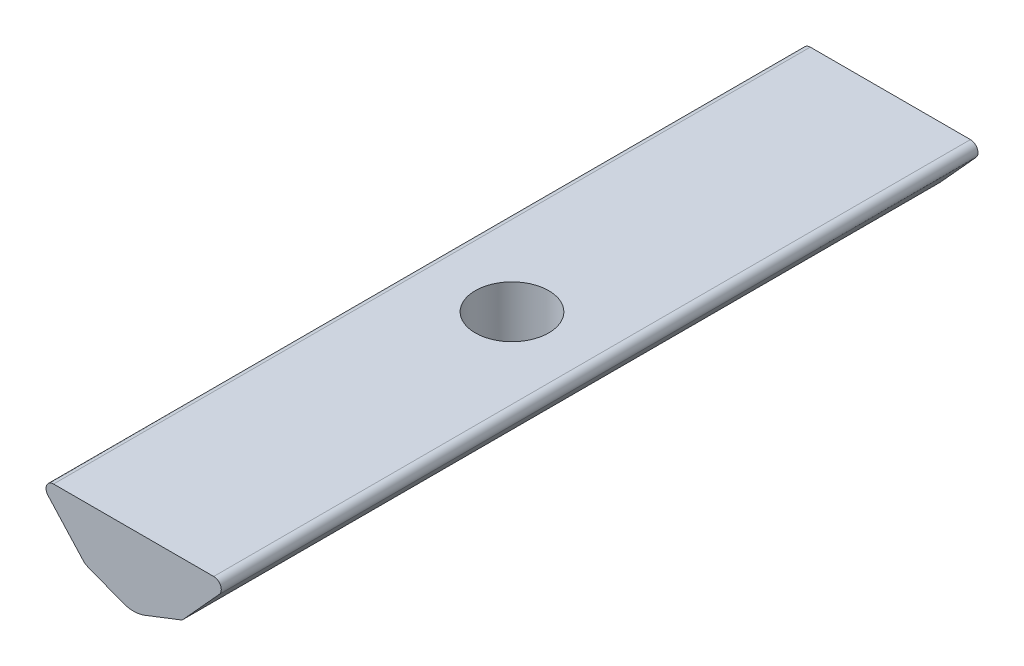
ISO-10303-21;
HEADER;
FILE_DESCRIPTION(('STEP AP214'),'2;1');
FILE_NAME('part.step','',(''),(''),'','','');
FILE_SCHEMA(('AUTOMOTIVE_DESIGN { 1 0 10303 214 1 1 1 1 }'));
ENDSEC;
DATA;
#1=APPLICATION_CONTEXT('core data for automotive mechanical design processes');
#2=APPLICATION_PROTOCOL_DEFINITION('international standard','automotive_design',2000,#1);
#3=PRODUCT_CONTEXT('',#1,'mechanical');
#4=PRODUCT('Part','Part','',(#3));
#5=PRODUCT_RELATED_PRODUCT_CATEGORY('part','',(#4));
#6=PRODUCT_DEFINITION_FORMATION('','',#4);
#7=PRODUCT_DEFINITION_CONTEXT('part definition',#1,'design');
#8=PRODUCT_DEFINITION('design','',#6,#7);
#9=PRODUCT_DEFINITION_SHAPE('','',#8);
#10=(LENGTH_UNIT() NAMED_UNIT(*) SI_UNIT(.MILLI.,.METRE.));
#11=(NAMED_UNIT(*) PLANE_ANGLE_UNIT() SI_UNIT($,.RADIAN.));
#12=(NAMED_UNIT(*) SI_UNIT($,.STERADIAN.) SOLID_ANGLE_UNIT());
#13=UNCERTAINTY_MEASURE_WITH_UNIT(LENGTH_MEASURE(1.E-05),#10,'distance_accuracy_value','');
#14=(GEOMETRIC_REPRESENTATION_CONTEXT(3) GLOBAL_UNCERTAINTY_ASSIGNED_CONTEXT((#13)) GLOBAL_UNIT_ASSIGNED_CONTEXT((#10,
#11,#12)) REPRESENTATION_CONTEXT('',''));
#15=CARTESIAN_POINT('',(0.,0.,0.));
#16=DIRECTION('',(0.,0.,1.));
#17=DIRECTION('',(1.,0.,0.));
#18=AXIS2_PLACEMENT_3D('',#15,#16,#17);
#19=CARTESIAN_POINT('',(0.,6.71094905755434,50.));
#20=DIRECTION('',(0.,0.,-1.));
#21=DIRECTION('',(-1.,0.,0.));
#22=AXIS2_PLACEMENT_3D('',#19,#20,#21);
#23=CYLINDRICAL_SURFACE('',#22,2.);
#24=DIRECTION('',(0.,0.,-1.));
#25=VECTOR('',#24,1.);
#26=CARTESIAN_POINT('',(-0.724911529102371,4.84694710611372,50.));
#27=LINE('',#26,#25);
#28=CARTESIAN_POINT('',(-0.724911529102371,4.84694710611372,50.));
#29=VERTEX_POINT('',#28);
#30=CARTESIAN_POINT('',(-0.724911529102371,4.84694710611372,27.3141150090206));
#31=VERTEX_POINT('',#30);
#32=EDGE_CURVE('E197',#29,#31,#27,.T.);
#33=ORIENTED_EDGE('',*,*,#32,.T.);
#34=CARTESIAN_POINT('',(-0.72491152910237,4.84694710611372,27.3141150090206));
#35=CARTESIAN_POINT('',(-0.68396626066702,4.83101759285053,27.3269478021643));
#36=CARTESIAN_POINT('',(-0.642219507065408,4.81634136108372,27.3388255267265));
#37=CARTESIAN_POINT('',(-0.557304845174793,4.78965039787589,27.3604979686707));
#38=CARTESIAN_POINT('',(-0.514135406777909,4.77763864702197,27.3702903528291));
#39=CARTESIAN_POINT('',(-0.426885883930136,4.75652504075858,27.3875430795497));
#40=CARTESIAN_POINT('',(-0.382811985637004,4.747407802296,27.3950157455102));
#41=CARTESIAN_POINT('',(-0.293846547530834,4.73213908139661,27.4075495306874));
#42=CARTESIAN_POINT('',(-0.248955669557782,4.72598530032541,27.4126125189582));
#43=CARTESIAN_POINT('',(-0.170043681918604,4.71790192279652,27.4192680867023));
#44=CARTESIAN_POINT('',(-0.136136616591713,4.71529838555691,27.4214138822751));
#45=CARTESIAN_POINT('',(-0.0681584787344195,4.71182019645505,27.4242814773846));
#46=CARTESIAN_POINT('',(-0.0340873148133231,4.71094665666505,27.4250023609627));
#47=CARTESIAN_POINT('',(0.0912179154796924,4.71095548235244,27.4249936820457));
#48=CARTESIAN_POINT('',(0.182551487772947,4.71723453323314,27.4198081976501));
#49=CARTESIAN_POINT('',(0.362498583888331,4.74197251628672,27.3994677321597));
#50=CARTESIAN_POINT('',(0.451107863518688,4.76044953600084,27.384297946122));
#51=CARTESIAN_POINT('',(0.569211321438126,4.79336774330082,27.35748116636));
#52=CARTESIAN_POINT('',(0.600979144492399,4.80309150770116,27.3495761342245));
#53=CARTESIAN_POINT('',(0.663607258806658,4.82396520538076,27.3326585105084));
#54=CARTESIAN_POINT('',(0.69447040651174,4.83510987613599,27.3236500103781));
#55=CARTESIAN_POINT('',(0.724911529102372,4.84694710611371,27.3141150090206));
#56=B_SPLINE_CURVE_WITH_KNOTS('',3,(#34,#35,#36,#37,#38,#39,#40,#41,#42,#43,#44,#45,#46,#47,#48,
#49,#50,#51,#52,#53,#54,#55),.UNSPECIFIED.,.F.,.F.,(4,2,2,2,2,2,2,2,2,2,4),(0.,
0.137297670032554,0.274748160361976,0.411455435135719,0.548056500107227,0.650205351789695,
0.752419845233187,1.02594661244232,1.29987988772789,1.40228570577755,1.50432270572961),.UNSPECIFIED.);
#57=CARTESIAN_POINT('',(0.724911529102371,4.84694710611372,27.3141150090206));
#58=VERTEX_POINT('',#57);
#59=EDGE_CURVE('E56',#31,#58,#56,.T.);
#60=ORIENTED_EDGE('',*,*,#59,.T.);
#61=DIRECTION('',(0.,0.,-1.));
#62=VECTOR('',#61,1.);
#63=CARTESIAN_POINT('',(0.724911529102371,4.84694710611372,50.));
#64=LINE('',#63,#62);
#65=CARTESIAN_POINT('',(0.724911529102371,4.84694710611372,50.));
#66=VERTEX_POINT('',#65);
#67=EDGE_CURVE('E49',#66,#58,#64,.T.);
#68=ORIENTED_EDGE('',*,*,#67,.F.);
#69=CARTESIAN_POINT('',(0.,6.71094905755434,50.));
#70=DIRECTION('',(0.,0.,1.));
#71=DIRECTION('',(-1.,0.,0.));
#72=AXIS2_PLACEMENT_3D('',#69,#70,#71);
#73=CIRCLE('',#72,2.);
#74=EDGE_CURVE('E196',#29,#66,#73,.T.);
#75=ORIENTED_EDGE('',*,*,#74,.F.);
#76=EDGE_LOOP('',(#33,#60,#68,#75));
#77=FACE_BOUND('',#76,.T.);
#78=ADVANCED_FACE('F39',(#77),#23,.T.);
#79=CARTESIAN_POINT('',(0.724911529102371,4.84694710611372,22.6858849909794));
#80=VERTEX_POINT('',#79);
#81=CARTESIAN_POINT('',(0.724911529102371,4.84694710611372,0.));
#82=VERTEX_POINT('',#81);
#83=EDGE_CURVE('E224',#80,#82,#64,.T.);
#84=ORIENTED_EDGE('',*,*,#83,.F.);
#85=CARTESIAN_POINT('',(0.724911529102371,4.84694710611372,22.6858849909794));
#86=CARTESIAN_POINT('',(0.684519919395502,4.83123900740619,22.6732310910522));
#87=CARTESIAN_POINT('',(0.643374645819227,4.81675048977935,22.6615058526459));
#88=CARTESIAN_POINT('',(0.559721329790683,4.79036583886566,22.6400837696419));
#89=CARTESIAN_POINT('',(0.517212520854241,4.77847119404043,22.6303880898086));
#90=CARTESIAN_POINT('',(0.388148869129027,4.74698690038004,22.6046664602279));
#91=CARTESIAN_POINT('',(0.299848597668212,4.73151498126739,22.5919394477275));
#92=CARTESIAN_POINT('',(0.120766824138667,4.71255925018206,22.5763338580766));
#93=CARTESIAN_POINT('',(0.0299767720542045,4.70912389709427,22.5734950909979));
#94=CARTESIAN_POINT('',(-0.150964599735334,4.71460439255366,22.5780142208166));
#95=CARTESIAN_POINT('',(-0.241116133745786,4.72351587841488,22.5853685160532));
#96=CARTESIAN_POINT('',(-0.398108653359741,4.74973782101268,22.6068992304759));
#97=CARTESIAN_POINT('',(-0.46562963548881,4.76470667847894,22.6191677997903));
#98=CARTESIAN_POINT('',(-0.597704952285411,4.80111577236191,22.6488326739677));
#99=CARTESIAN_POINT('',(-0.662260912285703,4.8225524133567,22.6662261297957));
#100=CARTESIAN_POINT('',(-0.724911529102417,4.84694710611351,22.6858849909793));
#101=B_SPLINE_CURVE_WITH_KNOTS('',3,(#85,#86,#87,#88,#89,#90,#91,#92,#93,#94,#95,#96,#97,#98,
#99,#100),.UNSPECIFIED.,.F.,.F.,(4,2,2,2,2,2,2,4),(0.,0.135384598717728,0.270846682954363,
0.54107881074931,0.812397643424414,1.08362063156454,1.29380343565118,1.5038696143339),.UNSPECIFIED.);
#102=CARTESIAN_POINT('',(-0.724911529102371,4.84694710611372,22.6858849909794));
#103=VERTEX_POINT('',#102);
#104=EDGE_CURVE('E254',#80,#103,#101,.T.);
#105=ORIENTED_EDGE('',*,*,#104,.T.);
#106=CARTESIAN_POINT('',(-0.724911529102371,4.84694710611372,0.));
#107=VERTEX_POINT('',#106);
#108=EDGE_CURVE('E104',#103,#107,#27,.T.);
#109=ORIENTED_EDGE('',*,*,#108,.T.);
#110=CARTESIAN_POINT('',(0.,6.71094905755434,0.));
#111=DIRECTION('',(0.,0.,1.));
#112=DIRECTION('',(-1.,0.,0.));
#113=AXIS2_PLACEMENT_3D('',#110,#111,#112);
#114=CIRCLE('',#113,2.);
#115=EDGE_CURVE('E166',#107,#82,#114,.T.);
#116=ORIENTED_EDGE('',*,*,#115,.T.);
#117=EDGE_LOOP('',(#84,#105,#109,#116));
#118=FACE_BOUND('',#117,.T.);
#119=ADVANCED_FACE('F41',(#118),#23,.T.);
#120=CARTESIAN_POINT('',(0.724911529102371,4.84694710611372,50.));
#121=DIRECTION('',(-0.362455764551182,0.932000975720314,0.));
#122=DIRECTION('',(-0.932000975720314,-0.362455764551182,0.));
#123=AXIS2_PLACEMENT_3D('',#120,#121,#122);
#124=PLANE('',#123);
#125=ORIENTED_EDGE('',*,*,#67,.T.);
#126=CARTESIAN_POINT('',(0.,4.5650285573593,25.));
#127=DIRECTION('',(-0.362455764551182,0.932000975720314,0.));
#128=DIRECTION('',(0.932000975720314,0.362455764551182,0.));
#129=AXIS2_PLACEMENT_3D('',#126,#127,#128);
#130=ELLIPSE('',#129,2.60192860648648,2.425);
#131=EDGE_CURVE('E170',#58,#80,#130,.T.);
#132=ORIENTED_EDGE('',*,*,#131,.T.);
#133=ORIENTED_EDGE('',*,*,#83,.T.);
#134=DIRECTION('',(0.932000975720314,0.362455764551182,0.));
#135=VECTOR('',#134,1.);
#136=CARTESIAN_POINT('',(0.724911529102371,4.84694710611372,0.));
#137=LINE('',#136,#135);
#138=CARTESIAN_POINT('',(3.10018382778282,5.77069199422403,0.));
#139=VERTEX_POINT('',#138);
#140=EDGE_CURVE('E169',#82,#139,#137,.T.);
#141=ORIENTED_EDGE('',*,*,#140,.T.);
#142=DIRECTION('',(0.,0.,-1.));
#143=VECTOR('',#142,1.);
#144=CARTESIAN_POINT('',(3.10018382778282,5.77069199422403,50.));
#145=LINE('',#144,#143);
#146=CARTESIAN_POINT('',(3.10018382778282,5.77069199422403,50.));
#147=VERTEX_POINT('',#146);
#148=EDGE_CURVE('E221',#147,#139,#145,.T.);
#149=ORIENTED_EDGE('',*,*,#148,.F.);
#150=DIRECTION('',(0.932000975720314,0.362455764551182,0.));
#151=VECTOR('',#150,1.);
#152=CARTESIAN_POINT('',(0.724911529102371,4.84694710611372,50.));
#153=LINE('',#152,#151);
#154=EDGE_CURVE('E113',#66,#147,#153,.T.);
#155=ORIENTED_EDGE('',*,*,#154,.F.);
#156=EDGE_LOOP('',(#125,#132,#133,#141,#149,#155));
#157=FACE_BOUND('',#156,.T.);
#158=ADVANCED_FACE('F231',(#157),#124,.F.);
#159=CARTESIAN_POINT('',(2.91895594550723,6.23669248208419,50.));
#160=DIRECTION('',(0.,0.,-1.));
#161=DIRECTION('',(-1.,0.,0.));
#162=AXIS2_PLACEMENT_3D('',#159,#160,#161);
#163=CYLINDRICAL_SURFACE('',#162,0.5);
#164=CARTESIAN_POINT('',(2.91895594550723,6.23669248208419,0.));
#165=DIRECTION('',(0.,0.,1.));
#166=DIRECTION('',(1.,0.,0.));
#167=AXIS2_PLACEMENT_3D('',#164,#165,#166);
#168=CIRCLE('',#167,0.5);
#169=CARTESIAN_POINT('',(3.28919115696331,5.90064800854226,0.));
#170=VERTEX_POINT('',#169);
#171=EDGE_CURVE('E173',#139,#170,#168,.T.);
#172=ORIENTED_EDGE('',*,*,#171,.T.);
#173=DIRECTION('',(0.,0.,-1.));
#174=VECTOR('',#173,1.);
#175=CARTESIAN_POINT('',(3.28919115696331,5.90064800854226,50.));
#176=LINE('',#175,#174);
#177=CARTESIAN_POINT('',(3.28919115696331,5.90064800854226,50.));
#178=VERTEX_POINT('',#177);
#179=EDGE_CURVE('E217',#178,#170,#176,.T.);
#180=ORIENTED_EDGE('',*,*,#179,.F.);
#181=CARTESIAN_POINT('',(2.91895594550723,6.23669248208419,50.));
#182=DIRECTION('',(0.,0.,1.));
#183=DIRECTION('',(1.,0.,0.));
#184=AXIS2_PLACEMENT_3D('',#181,#182,#183);
#185=CIRCLE('',#184,0.5);
#186=EDGE_CURVE('E332',#147,#178,#185,.T.);
#187=ORIENTED_EDGE('',*,*,#186,.F.);
#188=ORIENTED_EDGE('',*,*,#148,.T.);
#189=EDGE_LOOP('',(#172,#180,#187,#188));
#190=FACE_BOUND('',#189,.T.);
#191=ADVANCED_FACE('F244',(#190),#163,.T.);
#192=CARTESIAN_POINT('',(3.28919115696331,5.90064800854226,50.));
#193=DIRECTION('',(-0.74047042291215,0.672088947083867,0.));
#194=DIRECTION('',(-0.672088947083867,-0.74047042291215,0.));
#195=AXIS2_PLACEMENT_3D('',#192,#193,#194);
#196=PLANE('',#195);
#197=DIRECTION('',(0.672088947083867,0.74047042291215,0.));
#198=VECTOR('',#197,1.);
#199=CARTESIAN_POINT('',(3.28919115696331,5.90064800854226,0.));
#200=LINE('',#199,#198);
#201=CARTESIAN_POINT('',(5.66116314095539,8.51395552645806,0.));
#202=VERTEX_POINT('',#201);
#203=EDGE_CURVE('E176',#170,#202,#200,.T.);
#204=ORIENTED_EDGE('',*,*,#203,.T.);
#205=DIRECTION('',(0.,0.,-1.));
#206=VECTOR('',#205,1.);
#207=CARTESIAN_POINT('',(5.66116314095539,8.51395552645806,50.));
#208=LINE('',#207,#206);
#209=CARTESIAN_POINT('',(5.66116314095539,8.51395552645806,50.));
#210=VERTEX_POINT('',#209);
#211=EDGE_CURVE('E213',#210,#202,#208,.T.);
#212=ORIENTED_EDGE('',*,*,#211,.F.);
#213=DIRECTION('',(0.672088947083867,0.74047042291215,0.));
#214=VECTOR('',#213,1.);
#215=CARTESIAN_POINT('',(3.28919115696331,5.90064800854226,50.));
#216=LINE('',#215,#214);
#217=EDGE_CURVE('E313',#178,#210,#216,.T.);
#218=ORIENTED_EDGE('',*,*,#217,.F.);
#219=ORIENTED_EDGE('',*,*,#179,.T.);
#220=EDGE_LOOP('',(#204,#212,#218,#219));
#221=FACE_BOUND('',#220,.T.);
#222=ADVANCED_FACE('F300',(#221),#196,.F.);
#223=CARTESIAN_POINT('',(5.29092792949932,8.85,50.));
#224=DIRECTION('',(0.,0.,-1.));
#225=DIRECTION('',(-1.,0.,0.));
#226=AXIS2_PLACEMENT_3D('',#223,#224,#225);
#227=CYLINDRICAL_SURFACE('',#226,0.5);
#228=CARTESIAN_POINT('',(5.29092792949932,8.85,0.));
#229=DIRECTION('',(0.,0.,1.));
#230=DIRECTION('',(-1.,0.,0.));
#231=AXIS2_PLACEMENT_3D('',#228,#229,#230);
#232=CIRCLE('',#231,0.5);
#233=CARTESIAN_POINT('',(5.29092792949931,9.35,0.));
#234=VERTEX_POINT('',#233);
#235=EDGE_CURVE('E179',#202,#234,#232,.T.);
#236=ORIENTED_EDGE('',*,*,#235,.T.);
#237=DIRECTION('',(0.,0.,-1.));
#238=VECTOR('',#237,1.);
#239=CARTESIAN_POINT('',(5.29092792949931,9.35,50.));
#240=LINE('',#239,#238);
#241=CARTESIAN_POINT('',(5.29092792949931,9.35,50.));
#242=VERTEX_POINT('',#241);
#243=EDGE_CURVE('E209',#242,#234,#240,.T.);
#244=ORIENTED_EDGE('',*,*,#243,.F.);
#245=CARTESIAN_POINT('',(5.29092792949932,8.85,50.));
#246=DIRECTION('',(0.,0.,1.));
#247=DIRECTION('',(-1.,0.,0.));
#248=AXIS2_PLACEMENT_3D('',#245,#246,#247);
#249=CIRCLE('',#248,0.5);
#250=EDGE_CURVE('E324',#210,#242,#249,.T.);
#251=ORIENTED_EDGE('',*,*,#250,.F.);
#252=ORIENTED_EDGE('',*,*,#211,.T.);
#253=EDGE_LOOP('',(#236,#244,#251,#252));
#254=FACE_BOUND('',#253,.T.);
#255=ADVANCED_FACE('F296',(#254),#227,.T.);
#256=CARTESIAN_POINT('',(-5.29092792949931,9.35,50.));
#257=DIRECTION('',(0.,-1.,0.));
#258=DIRECTION('',(0.,0.,-1.));
#259=AXIS2_PLACEMENT_3D('',#256,#257,#258);
#260=PLANE('',#259);
#261=CARTESIAN_POINT('',(0.,9.35,25.));
#262=DIRECTION('',(0.,1.,0.));
#263=DIRECTION('',(0.,0.,1.));
#264=AXIS2_PLACEMENT_3D('',#261,#262,#263);
#265=CIRCLE('',#264,2.425);
#266=CARTESIAN_POINT('',(0.,9.35,27.425));
#267=VERTEX_POINT('',#266);
#268=EDGE_CURVE('E257',#267,#267,#265,.T.);
#269=ORIENTED_EDGE('',*,*,#268,.F.);
#270=EDGE_LOOP('',(#269));
#271=FACE_BOUND('',#270,.T.);
#272=DIRECTION('',(-1.,0.,0.));
#273=VECTOR('',#272,1.);
#274=CARTESIAN_POINT('',(-5.29092792949931,9.35,0.));
#275=LINE('',#274,#273);
#276=CARTESIAN_POINT('',(-5.29092792949931,9.35,0.));
#277=VERTEX_POINT('',#276);
#278=EDGE_CURVE('E182',#234,#277,#275,.T.);
#279=ORIENTED_EDGE('',*,*,#278,.T.);
#280=DIRECTION('',(0.,0.,-1.));
#281=VECTOR('',#280,1.);
#282=CARTESIAN_POINT('',(-5.29092792949931,9.35,50.));
#283=LINE('',#282,#281);
#284=CARTESIAN_POINT('',(-5.29092792949931,9.35,50.));
#285=VERTEX_POINT('',#284);
#286=EDGE_CURVE('E205',#285,#277,#283,.T.);
#287=ORIENTED_EDGE('',*,*,#286,.F.);
#288=DIRECTION('',(-1.,0.,0.));
#289=VECTOR('',#288,1.);
#290=CARTESIAN_POINT('',(-5.29092792949931,9.35,50.));
#291=LINE('',#290,#289);
#292=EDGE_CURVE('E322',#242,#285,#291,.T.);
#293=ORIENTED_EDGE('',*,*,#292,.F.);
#294=ORIENTED_EDGE('',*,*,#243,.T.);
#295=EDGE_LOOP('',(#279,#287,#293,#294));
#296=FACE_BOUND('',#295,.T.);
#297=ADVANCED_FACE('F292',(#271,#296),#260,.F.);
#298=CARTESIAN_POINT('',(-5.29092792949932,8.85,50.));
#299=DIRECTION('',(0.,0.,-1.));
#300=DIRECTION('',(-1.,0.,0.));
#301=AXIS2_PLACEMENT_3D('',#298,#299,#300);
#302=CYLINDRICAL_SURFACE('',#301,0.5);
#303=CARTESIAN_POINT('',(-5.29092792949932,8.85,0.));
#304=DIRECTION('',(0.,0.,1.));
#305=DIRECTION('',(1.,0.,0.));
#306=AXIS2_PLACEMENT_3D('',#303,#304,#305);
#307=CIRCLE('',#306,0.5);
#308=CARTESIAN_POINT('',(-5.66116314095539,8.51395552645806,0.));
#309=VERTEX_POINT('',#308);
#310=EDGE_CURVE('E185',#277,#309,#307,.T.);
#311=ORIENTED_EDGE('',*,*,#310,.T.);
#312=DIRECTION('',(0.,0.,-1.));
#313=VECTOR('',#312,1.);
#314=CARTESIAN_POINT('',(-5.66116314095539,8.51395552645806,50.));
#315=LINE('',#314,#313);
#316=CARTESIAN_POINT('',(-5.66116314095539,8.51395552645806,50.));
#317=VERTEX_POINT('',#316);
#318=EDGE_CURVE('E155',#317,#309,#315,.T.);
#319=ORIENTED_EDGE('',*,*,#318,.F.);
#320=CARTESIAN_POINT('',(-5.29092792949932,8.85,50.));
#321=DIRECTION('',(0.,0.,1.));
#322=DIRECTION('',(1.,0.,0.));
#323=AXIS2_PLACEMENT_3D('',#320,#321,#322);
#324=CIRCLE('',#323,0.5);
#325=EDGE_CURVE('E141',#285,#317,#324,.T.);
#326=ORIENTED_EDGE('',*,*,#325,.F.);
#327=ORIENTED_EDGE('',*,*,#286,.T.);
#328=EDGE_LOOP('',(#311,#319,#326,#327));
#329=FACE_BOUND('',#328,.T.);
#330=ADVANCED_FACE('F289',(#329),#302,.T.);
#331=CARTESIAN_POINT('',(-3.28919115696331,5.90064800854226,50.));
#332=DIRECTION('',(0.74047042291215,0.672088947083867,0.));
#333=DIRECTION('',(-0.672088947083867,0.74047042291215,0.));
#334=AXIS2_PLACEMENT_3D('',#331,#332,#333);
#335=PLANE('',#334);
#336=DIRECTION('',(0.672088947083867,-0.74047042291215,0.));
#337=VECTOR('',#336,1.);
#338=CARTESIAN_POINT('',(-3.28919115696331,5.90064800854226,0.));
#339=LINE('',#338,#337);
#340=CARTESIAN_POINT('',(-3.28919115696331,5.90064800854226,0.));
#341=VERTEX_POINT('',#340);
#342=EDGE_CURVE('E151',#309,#341,#339,.T.);
#343=ORIENTED_EDGE('',*,*,#342,.T.);
#344=DIRECTION('',(0.,0.,-1.));
#345=VECTOR('',#344,1.);
#346=CARTESIAN_POINT('',(-3.28919115696331,5.90064800854226,50.));
#347=LINE('',#346,#345);
#348=CARTESIAN_POINT('',(-3.28919115696331,5.90064800854226,50.));
#349=VERTEX_POINT('',#348);
#350=EDGE_CURVE('E148',#349,#341,#347,.T.);
#351=ORIENTED_EDGE('',*,*,#350,.F.);
#352=DIRECTION('',(0.672088947083867,-0.74047042291215,0.));
#353=VECTOR('',#352,1.);
#354=CARTESIAN_POINT('',(-3.28919115696331,5.90064800854226,50.));
#355=LINE('',#354,#353);
#356=EDGE_CURVE('E134',#317,#349,#355,.T.);
#357=ORIENTED_EDGE('',*,*,#356,.F.);
#358=ORIENTED_EDGE('',*,*,#318,.T.);
#359=EDGE_LOOP('',(#343,#351,#357,#358));
#360=FACE_BOUND('',#359,.T.);
#361=ADVANCED_FACE('F149',(#360),#335,.F.);
#362=CARTESIAN_POINT('',(-2.91895594550723,6.23669248208419,50.));
#363=DIRECTION('',(0.,0.,-1.));
#364=DIRECTION('',(-1.,0.,0.));
#365=AXIS2_PLACEMENT_3D('',#362,#363,#364);
#366=CYLINDRICAL_SURFACE('',#365,0.5);
#367=CARTESIAN_POINT('',(-2.91895594550723,6.23669248208419,0.));
#368=DIRECTION('',(0.,0.,1.));
#369=DIRECTION('',(-1.,0.,0.));
#370=AXIS2_PLACEMENT_3D('',#367,#368,#369);
#371=CIRCLE('',#370,0.5);
#372=CARTESIAN_POINT('',(-3.10018382778282,5.77069199422403,0.));
#373=VERTEX_POINT('',#372);
#374=EDGE_CURVE('E190',#341,#373,#371,.T.);
#375=ORIENTED_EDGE('',*,*,#374,.T.);
#376=DIRECTION('',(0.,0.,-1.));
#377=VECTOR('',#376,1.);
#378=CARTESIAN_POINT('',(-3.10018382778282,5.77069199422403,50.));
#379=LINE('',#378,#377);
#380=CARTESIAN_POINT('',(-3.10018382778282,5.77069199422403,50.));
#381=VERTEX_POINT('',#380);
#382=EDGE_CURVE('E156',#381,#373,#379,.T.);
#383=ORIENTED_EDGE('',*,*,#382,.F.);
#384=CARTESIAN_POINT('',(-2.91895594550723,6.23669248208419,50.));
#385=DIRECTION('',(0.,0.,1.));
#386=DIRECTION('',(-1.,0.,0.));
#387=AXIS2_PLACEMENT_3D('',#384,#385,#386);
#388=CIRCLE('',#387,0.5);
#389=EDGE_CURVE('E138',#349,#381,#388,.T.);
#390=ORIENTED_EDGE('',*,*,#389,.F.);
#391=ORIENTED_EDGE('',*,*,#350,.T.);
#392=EDGE_LOOP('',(#375,#383,#390,#391));
#393=FACE_BOUND('',#392,.T.);
#394=ADVANCED_FACE('F158',(#393),#366,.T.);
#395=CARTESIAN_POINT('',(-0.724911529102371,4.84694710611372,50.));
#396=DIRECTION('',(0.362455764551182,0.932000975720314,0.));
#397=DIRECTION('',(-0.932000975720314,0.362455764551182,0.));
#398=AXIS2_PLACEMENT_3D('',#395,#396,#397);
#399=PLANE('',#398);
#400=ORIENTED_EDGE('',*,*,#108,.F.);
#401=CARTESIAN_POINT('',(0.,4.5650285573593,25.));
#402=DIRECTION('',(0.362455764551182,0.932000975720314,0.));
#403=DIRECTION('',(-0.932000975720314,0.362455764551182,0.));
#404=AXIS2_PLACEMENT_3D('',#401,#402,#403);
#405=ELLIPSE('',#404,2.60192860648648,2.425);
#406=EDGE_CURVE('E11',#103,#31,#405,.T.);
#407=ORIENTED_EDGE('',*,*,#406,.T.);
#408=ORIENTED_EDGE('',*,*,#32,.F.);
#409=DIRECTION('',(0.932000975720314,-0.362455764551182,0.));
#410=VECTOR('',#409,1.);
#411=CARTESIAN_POINT('',(-0.724911529102371,4.84694710611372,50.));
#412=LINE('',#411,#410);
#413=EDGE_CURVE('E64',#381,#29,#412,.T.);
#414=ORIENTED_EDGE('',*,*,#413,.F.);
#415=ORIENTED_EDGE('',*,*,#382,.T.);
#416=DIRECTION('',(0.932000975720314,-0.362455764551182,0.));
#417=VECTOR('',#416,1.);
#418=CARTESIAN_POINT('',(-0.724911529102371,4.84694710611372,0.));
#419=LINE('',#418,#417);
#420=EDGE_CURVE('E193',#373,#107,#419,.T.);
#421=ORIENTED_EDGE('',*,*,#420,.T.);
#422=EDGE_LOOP('',(#400,#407,#408,#414,#415,#421));
#423=FACE_BOUND('',#422,.T.);
#424=ADVANCED_FACE('F250',(#423),#399,.F.);
#425=CARTESIAN_POINT('',(0.,6.71094905755434,50.));
#426=DIRECTION('',(0.,0.,-1.));
#427=DIRECTION('',(-1.,0.,0.));
#428=AXIS2_PLACEMENT_3D('',#425,#426,#427);
#429=PLANE('',#428);
#430=ORIENTED_EDGE('',*,*,#74,.T.);
#431=ORIENTED_EDGE('',*,*,#154,.T.);
#432=ORIENTED_EDGE('',*,*,#186,.T.);
#433=ORIENTED_EDGE('',*,*,#217,.T.);
#434=ORIENTED_EDGE('',*,*,#250,.T.);
#435=ORIENTED_EDGE('',*,*,#292,.T.);
#436=ORIENTED_EDGE('',*,*,#325,.T.);
#437=ORIENTED_EDGE('',*,*,#356,.T.);
#438=ORIENTED_EDGE('',*,*,#389,.T.);
#439=ORIENTED_EDGE('',*,*,#413,.T.);
#440=EDGE_LOOP('',(#430,#431,#432,#433,#434,#435,#436,#437,#438,#439));
#441=FACE_BOUND('',#440,.T.);
#442=ADVANCED_FACE('F136',(#441),#429,.F.);
#443=CARTESIAN_POINT('',(0.,6.71094905755434,0.));
#444=DIRECTION('',(0.,0.,-1.));
#445=DIRECTION('',(-1.,0.,0.));
#446=AXIS2_PLACEMENT_3D('',#443,#444,#445);
#447=PLANE('',#446);
#448=ORIENTED_EDGE('',*,*,#115,.F.);
#449=ORIENTED_EDGE('',*,*,#420,.F.);
#450=ORIENTED_EDGE('',*,*,#374,.F.);
#451=ORIENTED_EDGE('',*,*,#342,.F.);
#452=ORIENTED_EDGE('',*,*,#310,.F.);
#453=ORIENTED_EDGE('',*,*,#278,.F.);
#454=ORIENTED_EDGE('',*,*,#235,.F.);
#455=ORIENTED_EDGE('',*,*,#203,.F.);
#456=ORIENTED_EDGE('',*,*,#171,.F.);
#457=ORIENTED_EDGE('',*,*,#140,.F.);
#458=EDGE_LOOP('',(#448,#449,#450,#451,#452,#453,#454,#455,#456,#457));
#459=FACE_BOUND('',#458,.T.);
#460=ADVANCED_FACE('F236',(#459),#447,.T.);
#461=CARTESIAN_POINT('',(0.,4.71094905755434,25.));
#462=DIRECTION('',(0.,1.,0.));
#463=DIRECTION('',(0.,0.,1.));
#464=AXIS2_PLACEMENT_3D('',#461,#462,#463);
#465=CYLINDRICAL_SURFACE('',#464,2.425);
#466=ORIENTED_EDGE('',*,*,#268,.T.);
#467=EDGE_LOOP('',(#466));
#468=FACE_BOUND('',#467,.T.);
#469=ORIENTED_EDGE('',*,*,#59,.F.);
#470=ORIENTED_EDGE('',*,*,#406,.F.);
#471=ORIENTED_EDGE('',*,*,#104,.F.);
#472=ORIENTED_EDGE('',*,*,#131,.F.);
#473=EDGE_LOOP('',(#469,#470,#471,#472));
#474=FACE_BOUND('',#473,.T.);
#475=ADVANCED_FACE('F253',(#468,#474),#465,.F.);
#476=CLOSED_SHELL('',(#78,#119,#158,#191,#222,#255,#297,#330,#361,#394,#424,#442,#460,#475));
#477=MANIFOLD_SOLID_BREP('B2',#476);
#478=ADVANCED_BREP_SHAPE_REPRESENTATION('',(#18,#477),#14);
#479=SHAPE_DEFINITION_REPRESENTATION(#9,#478);
ENDSEC;
END-ISO-10303-21;
